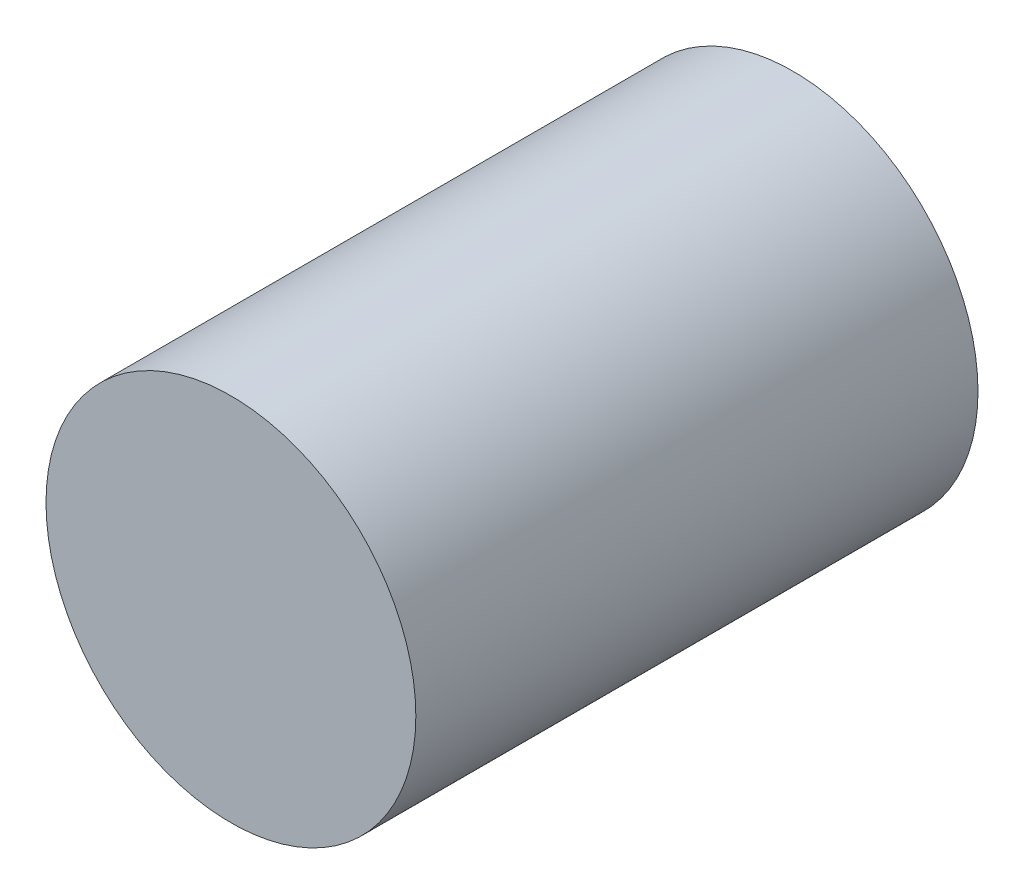
ISO-10303-21;
HEADER;
FILE_DESCRIPTION(('STEP AP214'),'2;1');
FILE_NAME('part.step','',(''),(''),'','','');
FILE_SCHEMA(('AUTOMOTIVE_DESIGN { 1 0 10303 214 1 1 1 1 }'));
ENDSEC;
DATA;
#1=APPLICATION_CONTEXT('core data for automotive mechanical design processes');
#2=APPLICATION_PROTOCOL_DEFINITION('international standard','automotive_design',2000,#1);
#3=PRODUCT_CONTEXT('',#1,'mechanical');
#4=PRODUCT('Part','Part','',(#3));
#5=PRODUCT_RELATED_PRODUCT_CATEGORY('part','',(#4));
#6=PRODUCT_DEFINITION_FORMATION('','',#4);
#7=PRODUCT_DEFINITION_CONTEXT('part definition',#1,'design');
#8=PRODUCT_DEFINITION('design','',#6,#7);
#9=PRODUCT_DEFINITION_SHAPE('','',#8);
#10=(LENGTH_UNIT() NAMED_UNIT(*) SI_UNIT(.MILLI.,.METRE.));
#11=(NAMED_UNIT(*) PLANE_ANGLE_UNIT() SI_UNIT($,.RADIAN.));
#12=(NAMED_UNIT(*) SI_UNIT($,.STERADIAN.) SOLID_ANGLE_UNIT());
#13=UNCERTAINTY_MEASURE_WITH_UNIT(LENGTH_MEASURE(1.E-05),#10,'distance_accuracy_value','');
#14=(GEOMETRIC_REPRESENTATION_CONTEXT(3) GLOBAL_UNCERTAINTY_ASSIGNED_CONTEXT((#13)) GLOBAL_UNIT_ASSIGNED_CONTEXT((#10,
#11,#12)) REPRESENTATION_CONTEXT('',''));
#15=CARTESIAN_POINT('',(0.,0.,0.));
#16=DIRECTION('',(0.,0.,1.));
#17=DIRECTION('',(1.,0.,0.));
#18=AXIS2_PLACEMENT_3D('',#15,#16,#17);
#19=CARTESIAN_POINT('',(-0.40574280916994,-16.3823769090956,0.76));
#20=DIRECTION('',(0.,0.,-1.));
#21=DIRECTION('',(-1.,0.,0.));
#22=AXIS2_PLACEMENT_3D('',#19,#20,#21);
#23=CYLINDRICAL_SURFACE('',#22,0.249999999999991);
#24=CARTESIAN_POINT('',(-0.40574280916994,-16.3823769090956,0.76));
#25=DIRECTION('',(0.,0.,1.));
#26=DIRECTION('',(1.,0.,0.));
#27=AXIS2_PLACEMENT_3D('',#24,#25,#26);
#28=CIRCLE('',#27,0.249999999999991);
#29=CARTESIAN_POINT('',(-0.155742809169949,-16.3823769090956,0.76));
#30=VERTEX_POINT('',#29);
#31=EDGE_CURVE('E10',#30,#30,#28,.T.);
#32=ORIENTED_EDGE('',*,*,#31,.F.);
#33=EDGE_LOOP('',(#32));
#34=FACE_BOUND('',#33,.T.);
#35=CARTESIAN_POINT('',(-0.40574280916994,-16.3823769090956,0.));
#36=DIRECTION('',(0.,0.,1.));
#37=DIRECTION('',(1.,0.,0.));
#38=AXIS2_PLACEMENT_3D('',#35,#36,#37);
#39=CIRCLE('',#38,0.249999999999991);
#40=CARTESIAN_POINT('',(-0.155742809169949,-16.3823769090956,0.));
#41=VERTEX_POINT('',#40);
#42=EDGE_CURVE('E34',#41,#41,#39,.T.);
#43=ORIENTED_EDGE('',*,*,#42,.T.);
#44=EDGE_LOOP('',(#43));
#45=FACE_BOUND('',#44,.T.);
#46=ADVANCED_FACE('F31',(#34,#45),#23,.T.);
#47=CARTESIAN_POINT('',(-0.40574280916994,-16.3823769090956,0.76));
#48=DIRECTION('',(0.,0.,1.));
#49=DIRECTION('',(1.,0.,0.));
#50=AXIS2_PLACEMENT_3D('',#47,#48,#49);
#51=PLANE('',#50);
#52=ORIENTED_EDGE('',*,*,#31,.T.);
#53=EDGE_LOOP('',(#52));
#54=FACE_BOUND('',#53,.T.);
#55=ADVANCED_FACE('F46',(#54),#51,.T.);
#56=CARTESIAN_POINT('',(-0.40574280916994,-16.3823769090956,0.));
#57=DIRECTION('',(0.,0.,1.));
#58=DIRECTION('',(1.,0.,0.));
#59=AXIS2_PLACEMENT_3D('',#56,#57,#58);
#60=PLANE('',#59);
#61=ORIENTED_EDGE('',*,*,#42,.F.);
#62=EDGE_LOOP('',(#61));
#63=FACE_BOUND('',#62,.T.);
#64=ADVANCED_FACE('F44',(#63),#60,.F.);
#65=CLOSED_SHELL('',(#46,#55,#64));
#66=MANIFOLD_SOLID_BREP('B2',#65);
#67=ADVANCED_BREP_SHAPE_REPRESENTATION('',(#18,#66),#14);
#68=SHAPE_DEFINITION_REPRESENTATION(#9,#67);
ENDSEC;
END-ISO-10303-21;
